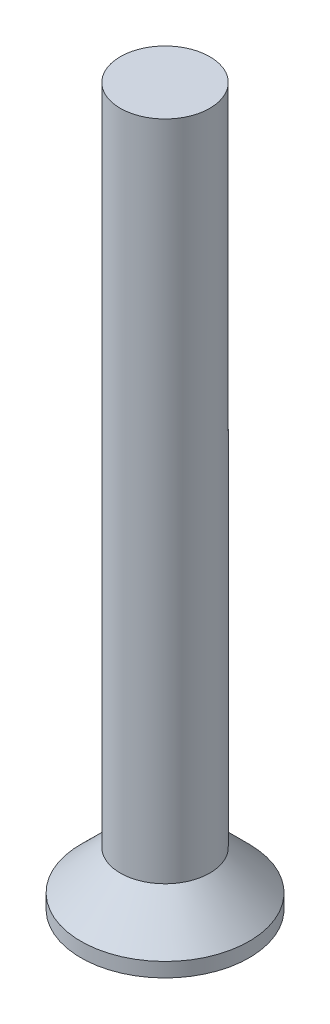
ISO-10303-21;
HEADER;
FILE_DESCRIPTION(('STEP AP214'),'2;1');
FILE_NAME('part.step','',(''),(''),'','','');
FILE_SCHEMA(('AUTOMOTIVE_DESIGN { 1 0 10303 214 1 1 1 1 }'));
ENDSEC;
DATA;
#1=APPLICATION_CONTEXT('core data for automotive mechanical design processes');
#2=APPLICATION_PROTOCOL_DEFINITION('international standard','automotive_design',2000,#1);
#3=PRODUCT_CONTEXT('',#1,'mechanical');
#4=PRODUCT('Part','Part','',(#3));
#5=PRODUCT_RELATED_PRODUCT_CATEGORY('part','',(#4));
#6=PRODUCT_DEFINITION_FORMATION('','',#4);
#7=PRODUCT_DEFINITION_CONTEXT('part definition',#1,'design');
#8=PRODUCT_DEFINITION('design','',#6,#7);
#9=PRODUCT_DEFINITION_SHAPE('','',#8);
#10=(LENGTH_UNIT() NAMED_UNIT(*) SI_UNIT(.MILLI.,.METRE.));
#11=(NAMED_UNIT(*) PLANE_ANGLE_UNIT() SI_UNIT($,.RADIAN.));
#12=(NAMED_UNIT(*) SI_UNIT($,.STERADIAN.) SOLID_ANGLE_UNIT());
#13=UNCERTAINTY_MEASURE_WITH_UNIT(LENGTH_MEASURE(1.E-05),#10,'distance_accuracy_value','');
#14=(GEOMETRIC_REPRESENTATION_CONTEXT(3) GLOBAL_UNCERTAINTY_ASSIGNED_CONTEXT((#13)) GLOBAL_UNIT_ASSIGNED_CONTEXT((#10,
#11,#12)) REPRESENTATION_CONTEXT('',''));
#15=CARTESIAN_POINT('',(0.,0.,0.));
#16=DIRECTION('',(0.,0.,1.));
#17=DIRECTION('',(1.,0.,0.));
#18=AXIS2_PLACEMENT_3D('',#15,#16,#17);
#19=CARTESIAN_POINT('',(0.,20.,0.));
#20=DIRECTION('',(0.,-1.,0.));
#21=DIRECTION('',(0.,0.,-1.));
#22=AXIS2_PLACEMENT_3D('',#19,#20,#21);
#23=CYLINDRICAL_SURFACE('',#22,1.25);
#24=CARTESIAN_POINT('',(0.,20.,0.));
#25=DIRECTION('',(0.,1.,0.));
#26=DIRECTION('',(0.,0.,1.));
#27=AXIS2_PLACEMENT_3D('',#24,#25,#26);
#28=CIRCLE('',#27,1.25);
#29=CARTESIAN_POINT('',(0.,20.,1.25));
#30=VERTEX_POINT('',#29);
#31=EDGE_CURVE('E49',#30,#30,#28,.T.);
#32=ORIENTED_EDGE('',*,*,#31,.F.);
#33=EDGE_LOOP('',(#32));
#34=FACE_BOUND('',#33,.T.);
#35=CARTESIAN_POINT('',(0.,1.5,0.));
#36=DIRECTION('',(0.,-1.,0.));
#37=DIRECTION('',(0.,0.,-1.));
#38=AXIS2_PLACEMENT_3D('',#35,#36,#37);
#39=CIRCLE('',#38,1.25);
#40=CARTESIAN_POINT('',(0.,1.5,-1.25));
#41=VERTEX_POINT('',#40);
#42=EDGE_CURVE('E11',#41,#41,#39,.T.);
#43=ORIENTED_EDGE('',*,*,#42,.F.);
#44=EDGE_LOOP('',(#43));
#45=FACE_BOUND('',#44,.T.);
#46=ADVANCED_FACE('F41',(#34,#45),#23,.T.);
#47=CARTESIAN_POINT('',(0.,20.,0.));
#48=DIRECTION('',(0.,1.,0.));
#49=DIRECTION('',(0.,0.,1.));
#50=AXIS2_PLACEMENT_3D('',#47,#48,#49);
#51=PLANE('',#50);
#52=ORIENTED_EDGE('',*,*,#31,.T.);
#53=EDGE_LOOP('',(#52));
#54=FACE_BOUND('',#53,.T.);
#55=ADVANCED_FACE('F253',(#54),#51,.T.);
#56=CARTESIAN_POINT('',(0.,1.5,0.));
#57=DIRECTION('',(0.,-1.,0.));
#58=DIRECTION('',(0.,0.,-1.));
#59=AXIS2_PLACEMENT_3D('',#56,#57,#58);
#60=CONICAL_SURFACE('',#59,1.25,0.785398163397454);
#61=CARTESIAN_POINT('',(0.,0.400000000000013,0.));
#62=DIRECTION('',(0.,-1.,0.));
#63=DIRECTION('',(0.,0.,-1.));
#64=AXIS2_PLACEMENT_3D('',#61,#62,#63);
#65=CIRCLE('',#64,2.35);
#66=CARTESIAN_POINT('',(0.,0.400000000000013,-2.35));
#67=VERTEX_POINT('',#66);
#68=EDGE_CURVE('E246',#67,#67,#65,.T.);
#69=ORIENTED_EDGE('',*,*,#68,.F.);
#70=EDGE_LOOP('',(#69));
#71=FACE_BOUND('',#70,.T.);
#72=ORIENTED_EDGE('',*,*,#42,.T.);
#73=EDGE_LOOP('',(#72));
#74=FACE_BOUND('',#73,.T.);
#75=ADVANCED_FACE('F259',(#71,#74),#60,.T.);
#76=CARTESIAN_POINT('',(0.,-0.5,0.));
#77=DIRECTION('',(0.,-1.,0.));
#78=DIRECTION('',(0.,0.,-1.));
#79=AXIS2_PLACEMENT_3D('',#76,#77,#78);
#80=CYLINDRICAL_SURFACE('',#79,2.35);
#81=CARTESIAN_POINT('',(0.,0.,0.));
#82=DIRECTION('',(0.,-1.,0.));
#83=DIRECTION('',(0.,0.,-1.));
#84=AXIS2_PLACEMENT_3D('',#81,#82,#83);
#85=CIRCLE('',#84,2.35);
#86=CARTESIAN_POINT('',(0.,0.,-2.35));
#87=VERTEX_POINT('',#86);
#88=EDGE_CURVE('E215',#87,#87,#85,.T.);
#89=ORIENTED_EDGE('',*,*,#88,.F.);
#90=EDGE_LOOP('',(#89));
#91=FACE_BOUND('',#90,.T.);
#92=ORIENTED_EDGE('',*,*,#68,.T.);
#93=EDGE_LOOP('',(#92));
#94=FACE_BOUND('',#93,.T.);
#95=ADVANCED_FACE('F261',(#91,#94),#80,.T.);
#96=CARTESIAN_POINT('',(0.,0.,0.));
#97=DIRECTION('',(0.,1.,0.));
#98=DIRECTION('',(0.,0.,1.));
#99=AXIS2_PLACEMENT_3D('',#96,#97,#98);
#100=PLANE('',#99);
#101=DIRECTION('',(1.,0.,0.));
#102=VECTOR('',#101,1.);
#103=CARTESIAN_POINT('',(-1.5,0.,-0.25));
#104=LINE('',#103,#102);
#105=CARTESIAN_POINT('',(-1.5,0.,-0.25));
#106=VERTEX_POINT('',#105);
#107=CARTESIAN_POINT('',(-0.25,0.,-0.25));
#108=VERTEX_POINT('',#107);
#109=EDGE_CURVE('E172',#106,#108,#104,.T.);
#110=ORIENTED_EDGE('',*,*,#109,.F.);
#111=DIRECTION('',(0.,0.,-1.));
#112=VECTOR('',#111,1.);
#113=CARTESIAN_POINT('',(-1.5,0.,0.25));
#114=LINE('',#113,#112);
#115=CARTESIAN_POINT('',(-1.5,0.,0.25));
#116=VERTEX_POINT('',#115);
#117=EDGE_CURVE('E56',#116,#106,#114,.T.);
#118=ORIENTED_EDGE('',*,*,#117,.F.);
#119=DIRECTION('',(-1.,0.,0.));
#120=VECTOR('',#119,1.);
#121=CARTESIAN_POINT('',(-0.25,0.,0.25));
#122=LINE('',#121,#120);
#123=CARTESIAN_POINT('',(-0.25,0.,0.25));
#124=VERTEX_POINT('',#123);
#125=EDGE_CURVE('E209',#124,#116,#122,.T.);
#126=ORIENTED_EDGE('',*,*,#125,.F.);
#127=DIRECTION('',(0.,0.,-1.));
#128=VECTOR('',#127,1.);
#129=CARTESIAN_POINT('',(-0.25,0.,1.5));
#130=LINE('',#129,#128);
#131=CARTESIAN_POINT('',(-0.25,0.,1.5));
#132=VERTEX_POINT('',#131);
#133=EDGE_CURVE('E206',#132,#124,#130,.T.);
#134=ORIENTED_EDGE('',*,*,#133,.F.);
#135=DIRECTION('',(-1.,0.,0.));
#136=VECTOR('',#135,1.);
#137=CARTESIAN_POINT('',(0.25,0.,1.5));
#138=LINE('',#137,#136);
#139=CARTESIAN_POINT('',(0.25,0.,1.5));
#140=VERTEX_POINT('',#139);
#141=EDGE_CURVE('E140',#140,#132,#138,.T.);
#142=ORIENTED_EDGE('',*,*,#141,.F.);
#143=DIRECTION('',(0.,0.,1.));
#144=VECTOR('',#143,1.);
#145=CARTESIAN_POINT('',(0.25,0.,0.25));
#146=LINE('',#145,#144);
#147=CARTESIAN_POINT('',(0.25,0.,0.25));
#148=VERTEX_POINT('',#147);
#149=EDGE_CURVE('E200',#148,#140,#146,.T.);
#150=ORIENTED_EDGE('',*,*,#149,.F.);
#151=DIRECTION('',(-1.,0.,0.));
#152=VECTOR('',#151,1.);
#153=CARTESIAN_POINT('',(1.5,0.,0.25));
#154=LINE('',#153,#152);
#155=CARTESIAN_POINT('',(1.5,0.,0.25));
#156=VERTEX_POINT('',#155);
#157=EDGE_CURVE('E196',#156,#148,#154,.T.);
#158=ORIENTED_EDGE('',*,*,#157,.F.);
#159=DIRECTION('',(0.,0.,1.));
#160=VECTOR('',#159,1.);
#161=CARTESIAN_POINT('',(1.5,0.,-0.25));
#162=LINE('',#161,#160);
#163=CARTESIAN_POINT('',(1.5,0.,-0.25));
#164=VERTEX_POINT('',#163);
#165=EDGE_CURVE('E192',#164,#156,#162,.T.);
#166=ORIENTED_EDGE('',*,*,#165,.F.);
#167=DIRECTION('',(1.,0.,0.));
#168=VECTOR('',#167,1.);
#169=CARTESIAN_POINT('',(0.25,0.,-0.25));
#170=LINE('',#169,#168);
#171=CARTESIAN_POINT('',(0.25,0.,-0.25));
#172=VERTEX_POINT('',#171);
#173=EDGE_CURVE('E188',#172,#164,#170,.T.);
#174=ORIENTED_EDGE('',*,*,#173,.F.);
#175=DIRECTION('',(0.,0.,1.));
#176=VECTOR('',#175,1.);
#177=CARTESIAN_POINT('',(0.25,0.,-1.5));
#178=LINE('',#177,#176);
#179=CARTESIAN_POINT('',(0.25,0.,-1.5));
#180=VERTEX_POINT('',#179);
#181=EDGE_CURVE('E184',#180,#172,#178,.T.);
#182=ORIENTED_EDGE('',*,*,#181,.F.);
#183=DIRECTION('',(1.,0.,0.));
#184=VECTOR('',#183,1.);
#185=CARTESIAN_POINT('',(-0.25,0.,-1.5));
#186=LINE('',#185,#184);
#187=CARTESIAN_POINT('',(-0.25,0.,-1.5));
#188=VERTEX_POINT('',#187);
#189=EDGE_CURVE('E180',#188,#180,#186,.T.);
#190=ORIENTED_EDGE('',*,*,#189,.F.);
#191=DIRECTION('',(0.,0.,-1.));
#192=VECTOR('',#191,1.);
#193=CARTESIAN_POINT('',(-0.25,0.,-0.25));
#194=LINE('',#193,#192);
#195=EDGE_CURVE('E176',#108,#188,#194,.T.);
#196=ORIENTED_EDGE('',*,*,#195,.F.);
#197=EDGE_LOOP('',(#110,#118,#126,#134,#142,#150,#158,#166,#174,#182,#190,#196));
#198=FACE_BOUND('',#197,.T.);
#199=ORIENTED_EDGE('',*,*,#88,.T.);
#200=EDGE_LOOP('',(#199));
#201=FACE_BOUND('',#200,.T.);
#202=ADVANCED_FACE('F268',(#198,#201),#100,.F.);
#203=CARTESIAN_POINT('',(-1.5,0.5,0.25));
#204=DIRECTION('',(-1.,0.,0.));
#205=DIRECTION('',(0.,0.,1.));
#206=AXIS2_PLACEMENT_3D('',#203,#204,#205);
#207=PLANE('',#206);
#208=ORIENTED_EDGE('',*,*,#117,.T.);
#209=DIRECTION('',(0.,-1.,0.));
#210=VECTOR('',#209,1.);
#211=CARTESIAN_POINT('',(-1.5,0.5,-0.25));
#212=LINE('',#211,#210);
#213=CARTESIAN_POINT('',(-1.5,0.5,-0.25));
#214=VERTEX_POINT('',#213);
#215=EDGE_CURVE('E104',#214,#106,#212,.T.);
#216=ORIENTED_EDGE('',*,*,#215,.F.);
#217=DIRECTION('',(0.,0.,-1.));
#218=VECTOR('',#217,1.);
#219=CARTESIAN_POINT('',(-1.5,0.5,0.25));
#220=LINE('',#219,#218);
#221=CARTESIAN_POINT('',(-1.5,0.5,0.25));
#222=VERTEX_POINT('',#221);
#223=EDGE_CURVE('E212',#222,#214,#220,.T.);
#224=ORIENTED_EDGE('',*,*,#223,.F.);
#225=DIRECTION('',(0.,-1.,0.));
#226=VECTOR('',#225,1.);
#227=CARTESIAN_POINT('',(-1.5,0.5,0.25));
#228=LINE('',#227,#226);
#229=EDGE_CURVE('E64',#222,#116,#228,.T.);
#230=ORIENTED_EDGE('',*,*,#229,.T.);
#231=EDGE_LOOP('',(#208,#216,#224,#230));
#232=FACE_BOUND('',#231,.T.);
#233=ADVANCED_FACE('F275',(#232),#207,.F.);
#234=CARTESIAN_POINT('',(-0.25,0.5,0.25));
#235=DIRECTION('',(0.,0.,1.));
#236=DIRECTION('',(1.,0.,0.));
#237=AXIS2_PLACEMENT_3D('',#234,#235,#236);
#238=PLANE('',#237);
#239=ORIENTED_EDGE('',*,*,#125,.T.);
#240=ORIENTED_EDGE('',*,*,#229,.F.);
#241=DIRECTION('',(-1.,0.,0.));
#242=VECTOR('',#241,1.);
#243=CARTESIAN_POINT('',(-0.25,0.5,0.25));
#244=LINE('',#243,#242);
#245=CARTESIAN_POINT('',(-0.25,0.5,0.25));
#246=VERTEX_POINT('',#245);
#247=EDGE_CURVE('E154',#246,#222,#244,.T.);
#248=ORIENTED_EDGE('',*,*,#247,.F.);
#249=DIRECTION('',(0.,-1.,0.));
#250=VECTOR('',#249,1.);
#251=CARTESIAN_POINT('',(-0.25,0.5,0.25));
#252=LINE('',#251,#250);
#253=EDGE_CURVE('E145',#246,#124,#252,.T.);
#254=ORIENTED_EDGE('',*,*,#253,.T.);
#255=EDGE_LOOP('',(#239,#240,#248,#254));
#256=FACE_BOUND('',#255,.T.);
#257=ADVANCED_FACE('F280',(#256),#238,.F.);
#258=CARTESIAN_POINT('',(-0.25,0.5,1.5));
#259=DIRECTION('',(-1.,0.,0.));
#260=DIRECTION('',(0.,0.,1.));
#261=AXIS2_PLACEMENT_3D('',#258,#259,#260);
#262=PLANE('',#261);
#263=ORIENTED_EDGE('',*,*,#133,.T.);
#264=ORIENTED_EDGE('',*,*,#253,.F.);
#265=DIRECTION('',(0.,0.,-1.));
#266=VECTOR('',#265,1.);
#267=CARTESIAN_POINT('',(-0.25,0.5,1.5));
#268=LINE('',#267,#266);
#269=CARTESIAN_POINT('',(-0.25,0.5,1.5));
#270=VERTEX_POINT('',#269);
#271=EDGE_CURVE('E149',#270,#246,#268,.T.);
#272=ORIENTED_EDGE('',*,*,#271,.F.);
#273=DIRECTION('',(0.,-1.,0.));
#274=VECTOR('',#273,1.);
#275=CARTESIAN_POINT('',(-0.25,0.5,1.5));
#276=LINE('',#275,#274);
#277=EDGE_CURVE('E133',#270,#132,#276,.T.);
#278=ORIENTED_EDGE('',*,*,#277,.T.);
#279=EDGE_LOOP('',(#263,#264,#272,#278));
#280=FACE_BOUND('',#279,.T.);
#281=ADVANCED_FACE('F150',(#280),#262,.F.);
#282=CARTESIAN_POINT('',(0.25,0.5,1.5));
#283=DIRECTION('',(0.,0.,1.));
#284=DIRECTION('',(1.,0.,0.));
#285=AXIS2_PLACEMENT_3D('',#282,#283,#284);
#286=PLANE('',#285);
#287=ORIENTED_EDGE('',*,*,#141,.T.);
#288=ORIENTED_EDGE('',*,*,#277,.F.);
#289=DIRECTION('',(-1.,0.,0.));
#290=VECTOR('',#289,1.);
#291=CARTESIAN_POINT('',(0.25,0.5,1.5));
#292=LINE('',#291,#290);
#293=CARTESIAN_POINT('',(0.25,0.5,1.5));
#294=VERTEX_POINT('',#293);
#295=EDGE_CURVE('E137',#294,#270,#292,.T.);
#296=ORIENTED_EDGE('',*,*,#295,.F.);
#297=DIRECTION('',(0.,-1.,0.));
#298=VECTOR('',#297,1.);
#299=CARTESIAN_POINT('',(0.25,0.5,1.5));
#300=LINE('',#299,#298);
#301=EDGE_CURVE('E146',#294,#140,#300,.T.);
#302=ORIENTED_EDGE('',*,*,#301,.T.);
#303=EDGE_LOOP('',(#287,#288,#296,#302));
#304=FACE_BOUND('',#303,.T.);
#305=ADVANCED_FACE('F135',(#304),#286,.F.);
#306=CARTESIAN_POINT('',(0.25,0.5,0.25));
#307=DIRECTION('',(1.,0.,0.));
#308=DIRECTION('',(0.,0.,-1.));
#309=AXIS2_PLACEMENT_3D('',#306,#307,#308);
#310=PLANE('',#309);
#311=ORIENTED_EDGE('',*,*,#149,.T.);
#312=ORIENTED_EDGE('',*,*,#301,.F.);
#313=DIRECTION('',(0.,0.,1.));
#314=VECTOR('',#313,1.);
#315=CARTESIAN_POINT('',(0.25,0.5,0.25));
#316=LINE('',#315,#314);
#317=CARTESIAN_POINT('',(0.25,0.5,0.25));
#318=VERTEX_POINT('',#317);
#319=EDGE_CURVE('E160',#318,#294,#316,.T.);
#320=ORIENTED_EDGE('',*,*,#319,.F.);
#321=DIRECTION('',(0.,-1.,0.));
#322=VECTOR('',#321,1.);
#323=CARTESIAN_POINT('',(0.25,0.5,0.25));
#324=LINE('',#323,#322);
#325=EDGE_CURVE('E220',#318,#148,#324,.T.);
#326=ORIENTED_EDGE('',*,*,#325,.T.);
#327=EDGE_LOOP('',(#311,#312,#320,#326));
#328=FACE_BOUND('',#327,.T.);
#329=ADVANCED_FACE('F325',(#328),#310,.F.);
#330=CARTESIAN_POINT('',(1.5,0.5,0.25));
#331=DIRECTION('',(0.,0.,1.));
#332=DIRECTION('',(1.,0.,0.));
#333=AXIS2_PLACEMENT_3D('',#330,#331,#332);
#334=PLANE('',#333);
#335=ORIENTED_EDGE('',*,*,#157,.T.);
#336=ORIENTED_EDGE('',*,*,#325,.F.);
#337=DIRECTION('',(-1.,0.,0.));
#338=VECTOR('',#337,1.);
#339=CARTESIAN_POINT('',(1.5,0.5,0.25));
#340=LINE('',#339,#338);
#341=CARTESIAN_POINT('',(1.5,0.5,0.25));
#342=VERTEX_POINT('',#341);
#343=EDGE_CURVE('E164',#342,#318,#340,.T.);
#344=ORIENTED_EDGE('',*,*,#343,.F.);
#345=DIRECTION('',(0.,-1.,0.));
#346=VECTOR('',#345,1.);
#347=CARTESIAN_POINT('',(1.5,0.5,0.25));
#348=LINE('',#347,#346);
#349=EDGE_CURVE('E223',#342,#156,#348,.T.);
#350=ORIENTED_EDGE('',*,*,#349,.T.);
#351=EDGE_LOOP('',(#335,#336,#344,#350));
#352=FACE_BOUND('',#351,.T.);
#353=ADVANCED_FACE('F321',(#352),#334,.F.);
#354=CARTESIAN_POINT('',(1.5,0.5,-0.25));
#355=DIRECTION('',(1.,0.,0.));
#356=DIRECTION('',(0.,0.,-1.));
#357=AXIS2_PLACEMENT_3D('',#354,#355,#356);
#358=PLANE('',#357);
#359=ORIENTED_EDGE('',*,*,#165,.T.);
#360=ORIENTED_EDGE('',*,*,#349,.F.);
#361=DIRECTION('',(0.,0.,1.));
#362=VECTOR('',#361,1.);
#363=CARTESIAN_POINT('',(1.5,0.5,-0.25));
#364=LINE('',#363,#362);
#365=CARTESIAN_POINT('',(1.5,0.5,-0.25));
#366=VERTEX_POINT('',#365);
#367=EDGE_CURVE('E314',#366,#342,#364,.T.);
#368=ORIENTED_EDGE('',*,*,#367,.F.);
#369=DIRECTION('',(0.,-1.,0.));
#370=VECTOR('',#369,1.);
#371=CARTESIAN_POINT('',(1.5,0.5,-0.25));
#372=LINE('',#371,#370);
#373=EDGE_CURVE('E226',#366,#164,#372,.T.);
#374=ORIENTED_EDGE('',*,*,#373,.T.);
#375=EDGE_LOOP('',(#359,#360,#368,#374));
#376=FACE_BOUND('',#375,.T.);
#377=ADVANCED_FACE('F340',(#376),#358,.F.);
#378=CARTESIAN_POINT('',(0.25,0.5,-0.25));
#379=DIRECTION('',(0.,0.,-1.));
#380=DIRECTION('',(-1.,0.,0.));
#381=AXIS2_PLACEMENT_3D('',#378,#379,#380);
#382=PLANE('',#381);
#383=ORIENTED_EDGE('',*,*,#173,.T.);
#384=ORIENTED_EDGE('',*,*,#373,.F.);
#385=DIRECTION('',(1.,0.,0.));
#386=VECTOR('',#385,1.);
#387=CARTESIAN_POINT('',(0.25,0.5,-0.25));
#388=LINE('',#387,#386);
#389=CARTESIAN_POINT('',(0.25,0.5,-0.25));
#390=VERTEX_POINT('',#389);
#391=EDGE_CURVE('E310',#390,#366,#388,.T.);
#392=ORIENTED_EDGE('',*,*,#391,.F.);
#393=DIRECTION('',(0.,-1.,0.));
#394=VECTOR('',#393,1.);
#395=CARTESIAN_POINT('',(0.25,0.5,-0.25));
#396=LINE('',#395,#394);
#397=EDGE_CURVE('E229',#390,#172,#396,.T.);
#398=ORIENTED_EDGE('',*,*,#397,.T.);
#399=EDGE_LOOP('',(#383,#384,#392,#398));
#400=FACE_BOUND('',#399,.T.);
#401=ADVANCED_FACE('F343',(#400),#382,.F.);
#402=CARTESIAN_POINT('',(0.25,0.5,-1.5));
#403=DIRECTION('',(1.,0.,0.));
#404=DIRECTION('',(0.,0.,-1.));
#405=AXIS2_PLACEMENT_3D('',#402,#403,#404);
#406=PLANE('',#405);
#407=ORIENTED_EDGE('',*,*,#181,.T.);
#408=ORIENTED_EDGE('',*,*,#397,.F.);
#409=DIRECTION('',(0.,0.,1.));
#410=VECTOR('',#409,1.);
#411=CARTESIAN_POINT('',(0.25,0.5,-1.5));
#412=LINE('',#411,#410);
#413=CARTESIAN_POINT('',(0.25,0.5,-1.5));
#414=VERTEX_POINT('',#413);
#415=EDGE_CURVE('E306',#414,#390,#412,.T.);
#416=ORIENTED_EDGE('',*,*,#415,.F.);
#417=DIRECTION('',(0.,-1.,0.));
#418=VECTOR('',#417,1.);
#419=CARTESIAN_POINT('',(0.25,0.5,-1.5));
#420=LINE('',#419,#418);
#421=EDGE_CURVE('E232',#414,#180,#420,.T.);
#422=ORIENTED_EDGE('',*,*,#421,.T.);
#423=EDGE_LOOP('',(#407,#408,#416,#422));
#424=FACE_BOUND('',#423,.T.);
#425=ADVANCED_FACE('F347',(#424),#406,.F.);
#426=CARTESIAN_POINT('',(-0.25,0.5,-1.5));
#427=DIRECTION('',(0.,0.,-1.));
#428=DIRECTION('',(-1.,0.,0.));
#429=AXIS2_PLACEMENT_3D('',#426,#427,#428);
#430=PLANE('',#429);
#431=ORIENTED_EDGE('',*,*,#189,.T.);
#432=ORIENTED_EDGE('',*,*,#421,.F.);
#433=DIRECTION('',(1.,0.,0.));
#434=VECTOR('',#433,1.);
#435=CARTESIAN_POINT('',(-0.25,0.5,-1.5));
#436=LINE('',#435,#434);
#437=CARTESIAN_POINT('',(-0.25,0.5,-1.5));
#438=VERTEX_POINT('',#437);
#439=EDGE_CURVE('E302',#438,#414,#436,.T.);
#440=ORIENTED_EDGE('',*,*,#439,.F.);
#441=DIRECTION('',(0.,-1.,0.));
#442=VECTOR('',#441,1.);
#443=CARTESIAN_POINT('',(-0.25,0.5,-1.5));
#444=LINE('',#443,#442);
#445=EDGE_CURVE('E235',#438,#188,#444,.T.);
#446=ORIENTED_EDGE('',*,*,#445,.T.);
#447=EDGE_LOOP('',(#431,#432,#440,#446));
#448=FACE_BOUND('',#447,.T.);
#449=ADVANCED_FACE('F351',(#448),#430,.F.);
#450=CARTESIAN_POINT('',(-0.25,0.5,-0.25));
#451=DIRECTION('',(-1.,0.,0.));
#452=DIRECTION('',(0.,0.,1.));
#453=AXIS2_PLACEMENT_3D('',#450,#451,#452);
#454=PLANE('',#453);
#455=ORIENTED_EDGE('',*,*,#195,.T.);
#456=ORIENTED_EDGE('',*,*,#445,.F.);
#457=DIRECTION('',(0.,0.,-1.));
#458=VECTOR('',#457,1.);
#459=CARTESIAN_POINT('',(-0.25,0.5,-0.25));
#460=LINE('',#459,#458);
#461=CARTESIAN_POINT('',(-0.25,0.5,-0.25));
#462=VERTEX_POINT('',#461);
#463=EDGE_CURVE('E295',#462,#438,#460,.T.);
#464=ORIENTED_EDGE('',*,*,#463,.F.);
#465=DIRECTION('',(0.,-1.,0.));
#466=VECTOR('',#465,1.);
#467=CARTESIAN_POINT('',(-0.25,0.5,-0.25));
#468=LINE('',#467,#466);
#469=EDGE_CURVE('E238',#462,#108,#468,.T.);
#470=ORIENTED_EDGE('',*,*,#469,.T.);
#471=EDGE_LOOP('',(#455,#456,#464,#470));
#472=FACE_BOUND('',#471,.T.);
#473=ADVANCED_FACE('F355',(#472),#454,.F.);
#474=CARTESIAN_POINT('',(-1.5,0.5,-0.25));
#475=DIRECTION('',(0.,0.,-1.));
#476=DIRECTION('',(-1.,0.,0.));
#477=AXIS2_PLACEMENT_3D('',#474,#475,#476);
#478=PLANE('',#477);
#479=ORIENTED_EDGE('',*,*,#109,.T.);
#480=ORIENTED_EDGE('',*,*,#469,.F.);
#481=DIRECTION('',(1.,0.,0.));
#482=VECTOR('',#481,1.);
#483=CARTESIAN_POINT('',(-1.5,0.5,-0.25));
#484=LINE('',#483,#482);
#485=EDGE_CURVE('E292',#214,#462,#484,.T.);
#486=ORIENTED_EDGE('',*,*,#485,.F.);
#487=ORIENTED_EDGE('',*,*,#215,.T.);
#488=EDGE_LOOP('',(#479,#480,#486,#487));
#489=FACE_BOUND('',#488,.T.);
#490=ADVANCED_FACE('F289',(#489),#478,.F.);
#491=CARTESIAN_POINT('',(0.,0.5,0.));
#492=DIRECTION('',(0.,-1.,0.));
#493=DIRECTION('',(0.,0.,-1.));
#494=AXIS2_PLACEMENT_3D('',#491,#492,#493);
#495=PLANE('',#494);
#496=ORIENTED_EDGE('',*,*,#223,.T.);
#497=ORIENTED_EDGE('',*,*,#485,.T.);
#498=ORIENTED_EDGE('',*,*,#463,.T.);
#499=ORIENTED_EDGE('',*,*,#439,.T.);
#500=ORIENTED_EDGE('',*,*,#415,.T.);
#501=ORIENTED_EDGE('',*,*,#391,.T.);
#502=ORIENTED_EDGE('',*,*,#367,.T.);
#503=ORIENTED_EDGE('',*,*,#343,.T.);
#504=ORIENTED_EDGE('',*,*,#319,.T.);
#505=ORIENTED_EDGE('',*,*,#295,.T.);
#506=ORIENTED_EDGE('',*,*,#271,.T.);
#507=ORIENTED_EDGE('',*,*,#247,.T.);
#508=EDGE_LOOP('',(#496,#497,#498,#499,#500,#501,#502,#503,#504,#505,#506,#507));
#509=FACE_BOUND('',#508,.T.);
#510=ADVANCED_FACE('F157',(#509),#495,.T.);
#511=CLOSED_SHELL('',(#46,#55,#75,#95,#202,#233,#257,#281,#305,#329,#353,#377,#401,#425,#449,
#473,#490,#510));
#512=MANIFOLD_SOLID_BREP('B2',#511);
#513=ADVANCED_BREP_SHAPE_REPRESENTATION('',(#18,#512),#14);
#514=SHAPE_DEFINITION_REPRESENTATION(#9,#513);
ENDSEC;
END-ISO-10303-21;
